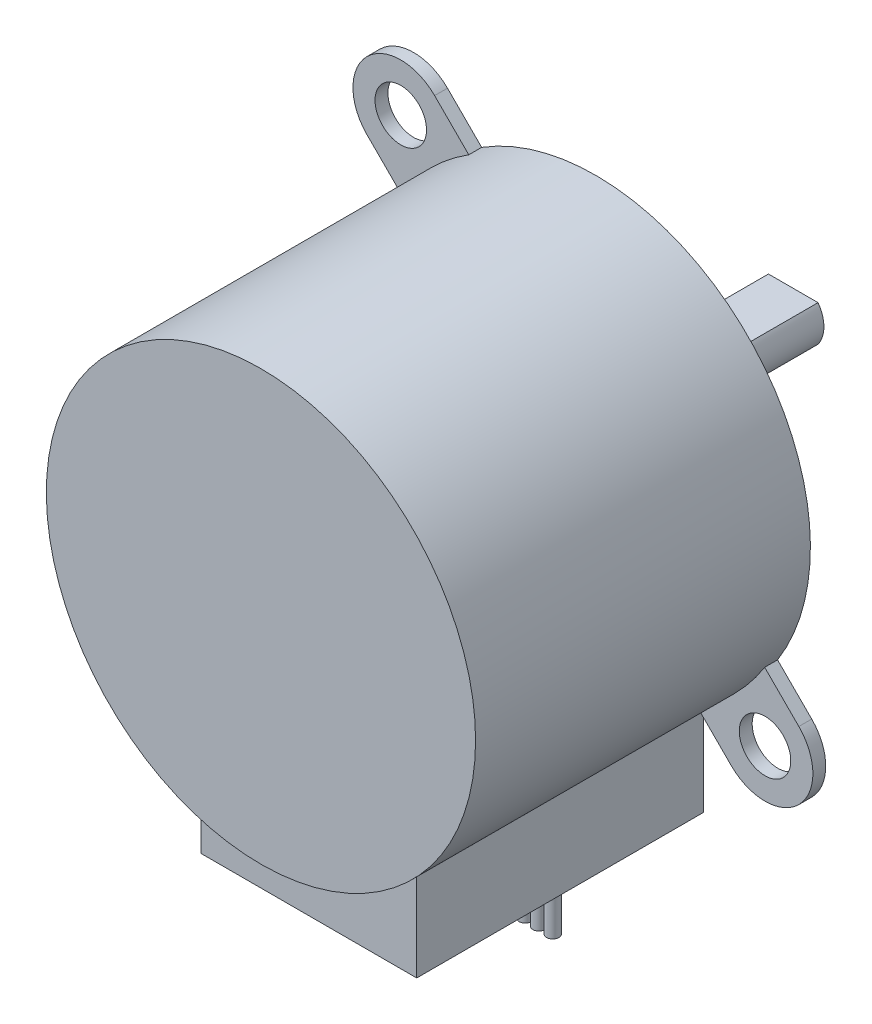
ISO-10303-21;
HEADER;
FILE_DESCRIPTION(('STEP AP214'),'2;1');
FILE_NAME('part.step','',(''),(''),'','','');
FILE_SCHEMA(('AUTOMOTIVE_DESIGN { 1 0 10303 214 1 1 1 1 }'));
ENDSEC;
DATA;
#1=APPLICATION_CONTEXT('core data for automotive mechanical design processes');
#2=APPLICATION_PROTOCOL_DEFINITION('international standard','automotive_design',2000,#1);
#3=PRODUCT_CONTEXT('',#1,'mechanical');
#4=PRODUCT('Part','Part','',(#3));
#5=PRODUCT_RELATED_PRODUCT_CATEGORY('part','',(#4));
#6=PRODUCT_DEFINITION_FORMATION('','',#4);
#7=PRODUCT_DEFINITION_CONTEXT('part definition',#1,'design');
#8=PRODUCT_DEFINITION('design','',#6,#7);
#9=PRODUCT_DEFINITION_SHAPE('','',#8);
#10=(LENGTH_UNIT() NAMED_UNIT(*) SI_UNIT(.MILLI.,.METRE.));
#11=(NAMED_UNIT(*) PLANE_ANGLE_UNIT() SI_UNIT($,.RADIAN.));
#12=(NAMED_UNIT(*) SI_UNIT($,.STERADIAN.) SOLID_ANGLE_UNIT());
#13=UNCERTAINTY_MEASURE_WITH_UNIT(LENGTH_MEASURE(1.E-05),#10,'distance_accuracy_value','');
#14=(GEOMETRIC_REPRESENTATION_CONTEXT(3) GLOBAL_UNCERTAINTY_ASSIGNED_CONTEXT((#13)) GLOBAL_UNIT_ASSIGNED_CONTEXT((#10,
#11,#12)) REPRESENTATION_CONTEXT('',''));
#15=CARTESIAN_POINT('',(0.,0.,0.));
#16=DIRECTION('',(0.,0.,1.));
#17=DIRECTION('',(1.,0.,0.));
#18=AXIS2_PLACEMENT_3D('',#15,#16,#17);
#19=CARTESIAN_POINT('',(0.,0.,27.3));
#20=DIRECTION('',(0.,0.,-1.));
#21=DIRECTION('',(-1.,0.,0.));
#22=AXIS2_PLACEMENT_3D('',#19,#20,#21);
#23=CYLINDRICAL_SURFACE('',#22,17.5);
#24=CARTESIAN_POINT('',(0.,0.,27.3));
#25=DIRECTION('',(0.,0.,1.));
#26=DIRECTION('',(1.,0.,0.));
#27=AXIS2_PLACEMENT_3D('',#24,#25,#26);
#28=CIRCLE('',#27,17.5);
#29=CARTESIAN_POINT('',(17.5,0.,27.3));
#30=VERTEX_POINT('',#29);
#31=EDGE_CURVE('E352',#30,#30,#28,.T.);
#32=ORIENTED_EDGE('',*,*,#31,.F.);
#33=EDGE_LOOP('',(#32));
#34=FACE_BOUND('',#33,.T.);
#35=DIRECTION('',(0.,0.,-1.));
#36=VECTOR('',#35,1.);
#37=CARTESIAN_POINT('',(-14.8208835266277,9.30545063337268,1.05));
#38=LINE('',#37,#36);
#39=CARTESIAN_POINT('',(-14.8208835266277,9.30545063337268,1.05));
#40=VERTEX_POINT('',#39);
#41=CARTESIAN_POINT('',(-14.8208835266277,9.30545063337268,0.));
#42=VERTEX_POINT('',#41);
#43=EDGE_CURVE('E248',#40,#42,#38,.T.);
#44=ORIENTED_EDGE('',*,*,#43,.T.);
#45=CARTESIAN_POINT('',(0.,0.,0.));
#46=DIRECTION('',(0.,0.,1.));
#47=DIRECTION('',(1.,0.,0.));
#48=AXIS2_PLACEMENT_3D('',#45,#46,#47);
#49=CIRCLE('',#48,17.5);
#50=CARTESIAN_POINT('',(-8.8,-15.1264668710178,0.));
#51=VERTEX_POINT('',#50);
#52=EDGE_CURVE('E350',#42,#51,#49,.T.);
#53=ORIENTED_EDGE('',*,*,#52,.T.);
#54=DIRECTION('',(0.,0.,-1.));
#55=VECTOR('',#54,1.);
#56=CARTESIAN_POINT('',(-8.8,-15.1264668710178,23.4));
#57=LINE('',#56,#55);
#58=CARTESIAN_POINT('',(-8.8,-15.1264668710178,23.4));
#59=VERTEX_POINT('',#58);
#60=EDGE_CURVE('E301',#59,#51,#57,.T.);
#61=ORIENTED_EDGE('',*,*,#60,.F.);
#62=CARTESIAN_POINT('',(0.,0.,23.4));
#63=DIRECTION('',(0.,0.,-1.));
#64=DIRECTION('',(-1.,0.,0.));
#65=AXIS2_PLACEMENT_3D('',#62,#63,#64);
#66=CIRCLE('',#65,17.5);
#67=CARTESIAN_POINT('',(8.8,-15.1264668710178,23.4));
#68=VERTEX_POINT('',#67);
#69=EDGE_CURVE('E291',#68,#59,#66,.T.);
#70=ORIENTED_EDGE('',*,*,#69,.F.);
#71=DIRECTION('',(0.,0.,-1.));
#72=VECTOR('',#71,1.);
#73=CARTESIAN_POINT('',(8.8,-15.1264668710178,23.4));
#74=LINE('',#73,#72);
#75=CARTESIAN_POINT('',(8.8,-15.1264668710178,0.));
#76=VERTEX_POINT('',#75);
#77=EDGE_CURVE('E314',#68,#76,#74,.T.);
#78=ORIENTED_EDGE('',*,*,#77,.T.);
#79=CARTESIAN_POINT('',(9.30545063337268,-14.8208835266277,0.));
#80=VERTEX_POINT('',#79);
#81=EDGE_CURVE('E41',#76,#80,#49,.T.);
#82=ORIENTED_EDGE('',*,*,#81,.T.);
#83=DIRECTION('',(0.,0.,-1.));
#84=VECTOR('',#83,1.);
#85=CARTESIAN_POINT('',(9.30545063337268,-14.8208835266277,1.05));
#86=LINE('',#85,#84);
#87=CARTESIAN_POINT('',(9.30545063337268,-14.8208835266277,1.05));
#88=VERTEX_POINT('',#87);
#89=EDGE_CURVE('E285',#88,#80,#86,.T.);
#90=ORIENTED_EDGE('',*,*,#89,.F.);
#91=CARTESIAN_POINT('',(0.,0.,1.05));
#92=DIRECTION('',(0.,0.,-1.));
#93=DIRECTION('',(-1.,0.,0.));
#94=AXIS2_PLACEMENT_3D('',#91,#92,#93);
#95=CIRCLE('',#94,17.5);
#96=CARTESIAN_POINT('',(14.8208835266277,-9.30545063337263,1.05));
#97=VERTEX_POINT('',#96);
#98=EDGE_CURVE('E262',#97,#88,#95,.T.);
#99=ORIENTED_EDGE('',*,*,#98,.F.);
#100=DIRECTION('',(0.,0.,-1.));
#101=VECTOR('',#100,1.);
#102=CARTESIAN_POINT('',(14.8208835266277,-9.30545063337263,1.05));
#103=LINE('',#102,#101);
#104=CARTESIAN_POINT('',(14.8208835266277,-9.30545063337263,0.));
#105=VERTEX_POINT('',#104);
#106=EDGE_CURVE('E282',#97,#105,#103,.T.);
#107=ORIENTED_EDGE('',*,*,#106,.T.);
#108=CARTESIAN_POINT('',(-9.30545063337262,14.8208835266277,0.));
#109=VERTEX_POINT('',#108);
#110=EDGE_CURVE('E356',#105,#109,#49,.T.);
#111=ORIENTED_EDGE('',*,*,#110,.T.);
#112=DIRECTION('',(0.,0.,-1.));
#113=VECTOR('',#112,1.);
#114=CARTESIAN_POINT('',(-9.30545063337263,14.8208835266277,1.05));
#115=LINE('',#114,#113);
#116=CARTESIAN_POINT('',(-9.30545063337263,14.8208835266277,1.05));
#117=VERTEX_POINT('',#116);
#118=EDGE_CURVE('E62',#117,#109,#115,.T.);
#119=ORIENTED_EDGE('',*,*,#118,.F.);
#120=CARTESIAN_POINT('',(0.,0.,1.05));
#121=DIRECTION('',(0.,0.,-1.));
#122=DIRECTION('',(-1.,0.,0.));
#123=AXIS2_PLACEMENT_3D('',#120,#121,#122);
#124=CIRCLE('',#123,17.5);
#125=EDGE_CURVE('E228',#40,#117,#124,.T.);
#126=ORIENTED_EDGE('',*,*,#125,.F.);
#127=EDGE_LOOP('',(#44,#53,#61,#70,#78,#82,#90,#99,#107,#111,#119,#126));
#128=FACE_BOUND('',#127,.T.);
#129=ADVANCED_FACE('F38',(#34,#128),#23,.T.);
#130=CARTESIAN_POINT('',(0.,0.,-7.1));
#131=DIRECTION('',(0.,0.,-1.));
#132=DIRECTION('',(-1.,0.,0.));
#133=AXIS2_PLACEMENT_3D('',#130,#131,#132);
#134=PLANE('',#133);
#135=CARTESIAN_POINT('',(0.,0.,-7.1));
#136=DIRECTION('',(0.,0.,-1.));
#137=DIRECTION('',(-1.,0.,0.));
#138=AXIS2_PLACEMENT_3D('',#135,#136,#137);
#139=CIRCLE('',#138,2.5);
#140=CARTESIAN_POINT('',(-2.02215231869412,1.47,-7.1));
#141=VERTEX_POINT('',#140);
#142=CARTESIAN_POINT('',(2.02215231869412,1.47,-7.1));
#143=VERTEX_POINT('',#142);
#144=EDGE_CURVE('E345',#141,#143,#139,.T.);
#145=ORIENTED_EDGE('',*,*,#144,.T.);
#146=DIRECTION('',(-1.,0.,0.));
#147=VECTOR('',#146,1.);
#148=CARTESIAN_POINT('',(0.,1.47,-7.1));
#149=LINE('',#148,#147);
#150=EDGE_CURVE('E323',#143,#141,#149,.T.);
#151=ORIENTED_EDGE('',*,*,#150,.T.);
#152=EDGE_LOOP('',(#145,#151));
#153=FACE_BOUND('',#152,.T.);
#154=ADVANCED_FACE('F390',(#153),#134,.T.);
#155=CARTESIAN_POINT('',(0.,0.,27.3));
#156=DIRECTION('',(0.,0.,1.));
#157=DIRECTION('',(1.,0.,0.));
#158=AXIS2_PLACEMENT_3D('',#155,#156,#157);
#159=PLANE('',#158);
#160=ORIENTED_EDGE('',*,*,#31,.T.);
#161=EDGE_LOOP('',(#160));
#162=FACE_BOUND('',#161,.T.);
#163=ADVANCED_FACE('F395',(#162),#159,.T.);
#164=CARTESIAN_POINT('',(0.,0.,0.));
#165=DIRECTION('',(0.,0.,1.));
#166=DIRECTION('',(1.,0.,0.));
#167=AXIS2_PLACEMENT_3D('',#164,#165,#166);
#168=PLANE('',#167);
#169=CARTESIAN_POINT('',(0.,0.,0.));
#170=DIRECTION('',(0.,0.,-1.));
#171=DIRECTION('',(-1.,0.,0.));
#172=AXIS2_PLACEMENT_3D('',#169,#170,#171);
#173=CIRCLE('',#172,4.85);
#174=CARTESIAN_POINT('',(-4.85,0.,0.));
#175=VERTEX_POINT('',#174);
#176=EDGE_CURVE('E46',#175,#175,#173,.T.);
#177=ORIENTED_EDGE('',*,*,#176,.F.);
#178=EDGE_LOOP('',(#177));
#179=FACE_BOUND('',#178,.T.);
#180=ORIENTED_EDGE('',*,*,#81,.F.);
#181=DIRECTION('',(0.,-1.,0.));
#182=VECTOR('',#181,1.);
#183=CARTESIAN_POINT('',(8.8,0.,0.));
#184=LINE('',#183,#182);
#185=CARTESIAN_POINT('',(8.8,-23.08,0.));
#186=VERTEX_POINT('',#185);
#187=EDGE_CURVE('E304',#76,#186,#184,.T.);
#188=ORIENTED_EDGE('',*,*,#187,.T.);
#189=DIRECTION('',(-1.,0.,0.));
#190=VECTOR('',#189,1.);
#191=CARTESIAN_POINT('',(0.,-23.08,0.));
#192=LINE('',#191,#190);
#193=CARTESIAN_POINT('',(-8.8,-23.08,0.));
#194=VERTEX_POINT('',#193);
#195=EDGE_CURVE('E292',#186,#194,#192,.T.);
#196=ORIENTED_EDGE('',*,*,#195,.T.);
#197=DIRECTION('',(0.,-1.,0.));
#198=VECTOR('',#197,1.);
#199=CARTESIAN_POINT('',(-8.8,0.,0.));
#200=LINE('',#199,#198);
#201=EDGE_CURVE('E281',#51,#194,#200,.T.);
#202=ORIENTED_EDGE('',*,*,#201,.F.);
#203=ORIENTED_EDGE('',*,*,#52,.F.);
#204=DIRECTION('',(0.707106781186547,-0.707106781186548,0.));
#205=VECTOR('',#204,1.);
#206=CARTESIAN_POINT('',(-2.75771644662752,-2.75771644662751,0.));
#207=LINE('',#206,#205);
#208=CARTESIAN_POINT('',(-17.606958851545,12.09152595829,0.));
#209=VERTEX_POINT('',#208);
#210=EDGE_CURVE('E223',#209,#42,#207,.T.);
#211=ORIENTED_EDGE('',*,*,#210,.F.);
#212=CARTESIAN_POINT('',(-14.8492424049175,14.8492424049175,0.));
#213=DIRECTION('',(0.,0.,-1.));
#214=DIRECTION('',(-1.,0.,0.));
#215=AXIS2_PLACEMENT_3D('',#212,#213,#214);
#216=CIRCLE('',#215,3.9);
#217=CARTESIAN_POINT('',(-12.0915259582899,17.6069588515451,0.));
#218=VERTEX_POINT('',#217);
#219=EDGE_CURVE('E237',#209,#218,#216,.T.);
#220=ORIENTED_EDGE('',*,*,#219,.T.);
#221=DIRECTION('',(-0.707106781186545,0.70710678118655,0.));
#222=VECTOR('',#221,1.);
#223=CARTESIAN_POINT('',(2.75771644662752,2.7577164466275,0.));
#224=LINE('',#223,#222);
#225=EDGE_CURVE('E240',#109,#218,#224,.T.);
#226=ORIENTED_EDGE('',*,*,#225,.F.);
#227=ORIENTED_EDGE('',*,*,#110,.F.);
#228=DIRECTION('',(0.707106781186549,-0.707106781186546,0.));
#229=VECTOR('',#228,1.);
#230=CARTESIAN_POINT('',(2.75771644662751,2.75771644662753,0.));
#231=LINE('',#230,#229);
#232=CARTESIAN_POINT('',(17.606958851545,-12.09152595829,0.));
#233=VERTEX_POINT('',#232);
#234=EDGE_CURVE('E257',#105,#233,#231,.T.);
#235=ORIENTED_EDGE('',*,*,#234,.T.);
#236=CARTESIAN_POINT('',(14.8492424049174,-14.8492424049176,0.));
#237=DIRECTION('',(0.,0.,-1.));
#238=DIRECTION('',(-1.,0.,0.));
#239=AXIS2_PLACEMENT_3D('',#236,#237,#238);
#240=CIRCLE('',#239,3.9);
#241=CARTESIAN_POINT('',(12.0915259582899,-17.6069588515451,0.));
#242=VERTEX_POINT('',#241);
#243=EDGE_CURVE('E271',#242,#233,#240,.F.);
#244=ORIENTED_EDGE('',*,*,#243,.F.);
#245=DIRECTION('',(-0.707106781186548,0.707106781186547,0.));
#246=VECTOR('',#245,1.);
#247=CARTESIAN_POINT('',(-2.75771644662752,-2.75771644662752,0.));
#248=LINE('',#247,#246);
#249=EDGE_CURVE('E274',#242,#80,#248,.T.);
#250=ORIENTED_EDGE('',*,*,#249,.T.);
#251=EDGE_LOOP('',(#180,#188,#196,#202,#203,#211,#220,#226,#227,#235,#244,#250));
#252=FACE_BOUND('',#251,.T.);
#253=CARTESIAN_POINT('',(14.8492424049174,-14.8492424049176,0.));
#254=DIRECTION('',(0.,0.,-1.));
#255=DIRECTION('',(-1.,0.,0.));
#256=AXIS2_PLACEMENT_3D('',#253,#254,#255);
#257=CIRCLE('',#256,2.1);
#258=CARTESIAN_POINT('',(12.7492424049174,-14.8492424049176,0.));
#259=VERTEX_POINT('',#258);
#260=EDGE_CURVE('E247',#259,#259,#257,.T.);
#261=ORIENTED_EDGE('',*,*,#260,.F.);
#262=EDGE_LOOP('',(#261));
#263=FACE_BOUND('',#262,.T.);
#264=CARTESIAN_POINT('',(-14.8492424049175,14.8492424049175,0.));
#265=DIRECTION('',(0.,0.,-1.));
#266=DIRECTION('',(-1.,0.,0.));
#267=AXIS2_PLACEMENT_3D('',#264,#265,#266);
#268=CIRCLE('',#267,2.1);
#269=CARTESIAN_POINT('',(-16.9492424049175,14.8492424049175,0.));
#270=VERTEX_POINT('',#269);
#271=EDGE_CURVE('E215',#270,#270,#268,.T.);
#272=ORIENTED_EDGE('',*,*,#271,.F.);
#273=EDGE_LOOP('',(#272));
#274=FACE_BOUND('',#273,.T.);
#275=ADVANCED_FACE('F365',(#179,#252,#263,#274),#168,.F.);
#276=CARTESIAN_POINT('',(0.,0.,-2.5));
#277=DIRECTION('',(0.,0.,1.));
#278=DIRECTION('',(1.,0.,0.));
#279=AXIS2_PLACEMENT_3D('',#276,#277,#278);
#280=CYLINDRICAL_SURFACE('',#279,4.85);
#281=CARTESIAN_POINT('',(0.,0.,-2.5));
#282=DIRECTION('',(0.,0.,-1.));
#283=DIRECTION('',(-1.,0.,0.));
#284=AXIS2_PLACEMENT_3D('',#281,#282,#283);
#285=CIRCLE('',#284,4.85);
#286=CARTESIAN_POINT('',(-4.85,0.,-2.5));
#287=VERTEX_POINT('',#286);
#288=EDGE_CURVE('E346',#287,#287,#285,.T.);
#289=ORIENTED_EDGE('',*,*,#288,.F.);
#290=EDGE_LOOP('',(#289));
#291=FACE_BOUND('',#290,.T.);
#292=ORIENTED_EDGE('',*,*,#176,.T.);
#293=EDGE_LOOP('',(#292));
#294=FACE_BOUND('',#293,.T.);
#295=ADVANCED_FACE('F666',(#291,#294),#280,.T.);
#296=CARTESIAN_POINT('',(0.,0.,-2.5));
#297=DIRECTION('',(0.,0.,-1.));
#298=DIRECTION('',(-1.,0.,0.));
#299=AXIS2_PLACEMENT_3D('',#296,#297,#298);
#300=PLANE('',#299);
#301=CARTESIAN_POINT('',(0.,0.,-2.5));
#302=DIRECTION('',(0.,0.,-1.));
#303=DIRECTION('',(-1.,0.,0.));
#304=AXIS2_PLACEMENT_3D('',#301,#302,#303);
#305=CIRCLE('',#304,2.5);
#306=CARTESIAN_POINT('',(-2.5,0.,-2.5));
#307=VERTEX_POINT('',#306);
#308=EDGE_CURVE('E11',#307,#307,#305,.T.);
#309=ORIENTED_EDGE('',*,*,#308,.F.);
#310=EDGE_LOOP('',(#309));
#311=FACE_BOUND('',#310,.T.);
#312=ORIENTED_EDGE('',*,*,#288,.T.);
#313=EDGE_LOOP('',(#312));
#314=FACE_BOUND('',#313,.T.);
#315=ADVANCED_FACE('F415',(#311,#314),#300,.T.);
#316=CARTESIAN_POINT('',(0.,0.,-7.1));
#317=DIRECTION('',(0.,0.,1.));
#318=DIRECTION('',(1.,0.,0.));
#319=AXIS2_PLACEMENT_3D('',#316,#317,#318);
#320=CYLINDRICAL_SURFACE('',#319,2.5);
#321=ORIENTED_EDGE('',*,*,#144,.F.);
#322=DIRECTION('',(0.,0.,1.));
#323=VECTOR('',#322,1.);
#324=CARTESIAN_POINT('',(-2.02215231869412,1.47,-16.1));
#325=LINE('',#324,#323);
#326=CARTESIAN_POINT('',(-2.02215231869412,1.47,-16.1));
#327=VERTEX_POINT('',#326);
#328=EDGE_CURVE('E335',#327,#141,#325,.T.);
#329=ORIENTED_EDGE('',*,*,#328,.F.);
#330=CARTESIAN_POINT('',(0.,0.,-16.1));
#331=DIRECTION('',(0.,0.,-1.));
#332=DIRECTION('',(-1.,0.,0.));
#333=AXIS2_PLACEMENT_3D('',#330,#331,#332);
#334=CIRCLE('',#333,2.5);
#335=CARTESIAN_POINT('',(-2.02215231869412,-1.47,-16.1));
#336=VERTEX_POINT('',#335);
#337=EDGE_CURVE('E324',#336,#327,#334,.T.);
#338=ORIENTED_EDGE('',*,*,#337,.F.);
#339=DIRECTION('',(0.,0.,1.));
#340=VECTOR('',#339,1.);
#341=CARTESIAN_POINT('',(-2.02215231869412,-1.47,-16.1));
#342=LINE('',#341,#340);
#343=CARTESIAN_POINT('',(-2.02215231869412,-1.47,-7.1));
#344=VERTEX_POINT('',#343);
#345=EDGE_CURVE('E338',#336,#344,#342,.T.);
#346=ORIENTED_EDGE('',*,*,#345,.T.);
#347=CARTESIAN_POINT('',(2.02215231869412,-1.47,-7.1));
#348=VERTEX_POINT('',#347);
#349=EDGE_CURVE('E344',#348,#344,#139,.T.);
#350=ORIENTED_EDGE('',*,*,#349,.F.);
#351=DIRECTION('',(0.,0.,1.));
#352=VECTOR('',#351,1.);
#353=CARTESIAN_POINT('',(2.02215231869412,-1.47,-16.1));
#354=LINE('',#353,#352);
#355=CARTESIAN_POINT('',(2.02215231869412,-1.47,-16.1));
#356=VERTEX_POINT('',#355);
#357=EDGE_CURVE('E341',#356,#348,#354,.T.);
#358=ORIENTED_EDGE('',*,*,#357,.F.);
#359=CARTESIAN_POINT('',(2.02215231869412,1.47,-16.1));
#360=VERTEX_POINT('',#359);
#361=EDGE_CURVE('E319',#360,#356,#334,.T.);
#362=ORIENTED_EDGE('',*,*,#361,.F.);
#363=DIRECTION('',(0.,0.,1.));
#364=VECTOR('',#363,1.);
#365=CARTESIAN_POINT('',(2.02215231869412,1.47,-16.1));
#366=LINE('',#365,#364);
#367=EDGE_CURVE('E329',#360,#143,#366,.T.);
#368=ORIENTED_EDGE('',*,*,#367,.T.);
#369=EDGE_LOOP('',(#321,#329,#338,#346,#350,#358,#362,#368));
#370=FACE_BOUND('',#369,.T.);
#371=ORIENTED_EDGE('',*,*,#308,.T.);
#372=EDGE_LOOP('',(#371));
#373=FACE_BOUND('',#372,.T.);
#374=ADVANCED_FACE('F407',(#370,#373),#320,.T.);
#375=DIRECTION('',(-1.,0.,0.));
#376=VECTOR('',#375,1.);
#377=CARTESIAN_POINT('',(0.,-1.47,-7.1));
#378=LINE('',#377,#376);
#379=EDGE_CURVE('E311',#348,#344,#378,.T.);
#380=ORIENTED_EDGE('',*,*,#379,.F.);
#381=ORIENTED_EDGE('',*,*,#349,.T.);
#382=EDGE_LOOP('',(#380,#381));
#383=FACE_BOUND('',#382,.T.);
#384=ADVANCED_FACE('F398',(#383),#134,.T.);
#385=CARTESIAN_POINT('',(0.,-1.47,-16.1));
#386=DIRECTION('',(0.,1.,0.));
#387=DIRECTION('',(0.,0.,1.));
#388=AXIS2_PLACEMENT_3D('',#385,#386,#387);
#389=PLANE('',#388);
#390=ORIENTED_EDGE('',*,*,#379,.T.);
#391=ORIENTED_EDGE('',*,*,#345,.F.);
#392=DIRECTION('',(-1.,0.,0.));
#393=VECTOR('',#392,1.);
#394=CARTESIAN_POINT('',(0.,-1.47,-16.1));
#395=LINE('',#394,#393);
#396=EDGE_CURVE('E322',#356,#336,#395,.T.);
#397=ORIENTED_EDGE('',*,*,#396,.F.);
#398=ORIENTED_EDGE('',*,*,#357,.T.);
#399=EDGE_LOOP('',(#390,#391,#397,#398));
#400=FACE_BOUND('',#399,.T.);
#401=ADVANCED_FACE('F406',(#400),#389,.F.);
#402=CARTESIAN_POINT('',(0.,1.47,-16.1));
#403=DIRECTION('',(0.,1.,0.));
#404=DIRECTION('',(0.,0.,1.));
#405=AXIS2_PLACEMENT_3D('',#402,#403,#404);
#406=PLANE('',#405);
#407=ORIENTED_EDGE('',*,*,#150,.F.);
#408=ORIENTED_EDGE('',*,*,#367,.F.);
#409=DIRECTION('',(-1.,0.,0.));
#410=VECTOR('',#409,1.);
#411=CARTESIAN_POINT('',(0.,1.47,-16.1));
#412=LINE('',#411,#410);
#413=EDGE_CURVE('E326',#360,#327,#412,.T.);
#414=ORIENTED_EDGE('',*,*,#413,.T.);
#415=ORIENTED_EDGE('',*,*,#328,.T.);
#416=EDGE_LOOP('',(#407,#408,#414,#415));
#417=FACE_BOUND('',#416,.T.);
#418=ADVANCED_FACE('F413',(#417),#406,.T.);
#419=CARTESIAN_POINT('',(0.,0.,-16.1));
#420=DIRECTION('',(0.,0.,-1.));
#421=DIRECTION('',(-1.,0.,0.));
#422=AXIS2_PLACEMENT_3D('',#419,#420,#421);
#423=PLANE('',#422);
#424=ORIENTED_EDGE('',*,*,#361,.T.);
#425=ORIENTED_EDGE('',*,*,#396,.T.);
#426=ORIENTED_EDGE('',*,*,#337,.T.);
#427=ORIENTED_EDGE('',*,*,#413,.F.);
#428=EDGE_LOOP('',(#424,#425,#426,#427));
#429=FACE_BOUND('',#428,.T.);
#430=ADVANCED_FACE('F426',(#429),#423,.T.);
#431=CARTESIAN_POINT('',(-8.8,0.,23.4));
#432=DIRECTION('',(1.,0.,0.));
#433=DIRECTION('',(0.,1.,0.));
#434=AXIS2_PLACEMENT_3D('',#431,#432,#433);
#435=PLANE('',#434);
#436=ORIENTED_EDGE('',*,*,#201,.T.);
#437=DIRECTION('',(0.,0.,-1.));
#438=VECTOR('',#437,1.);
#439=CARTESIAN_POINT('',(-8.8,-23.08,23.4));
#440=LINE('',#439,#438);
#441=CARTESIAN_POINT('',(-8.8,-23.08,23.4));
#442=VERTEX_POINT('',#441);
#443=EDGE_CURVE('E309',#442,#194,#440,.T.);
#444=ORIENTED_EDGE('',*,*,#443,.F.);
#445=DIRECTION('',(0.,-1.,0.));
#446=VECTOR('',#445,1.);
#447=CARTESIAN_POINT('',(-8.8,0.,23.4));
#448=LINE('',#447,#446);
#449=EDGE_CURVE('E289',#59,#442,#448,.T.);
#450=ORIENTED_EDGE('',*,*,#449,.F.);
#451=ORIENTED_EDGE('',*,*,#60,.T.);
#452=EDGE_LOOP('',(#436,#444,#450,#451));
#453=FACE_BOUND('',#452,.T.);
#454=ADVANCED_FACE('F363',(#453),#435,.F.);
#455=CARTESIAN_POINT('',(0.,-23.08,23.4));
#456=DIRECTION('',(0.,-1.,0.));
#457=DIRECTION('',(0.,0.,-1.));
#458=AXIS2_PLACEMENT_3D('',#455,#456,#457);
#459=PLANE('',#458);
#460=CARTESIAN_POINT('',(-2.,-23.08,5.8));
#461=DIRECTION('',(0.,-1.,0.));
#462=DIRECTION('',(0.,0.,-1.));
#463=AXIS2_PLACEMENT_3D('',#460,#461,#462);
#464=CIRCLE('',#463,0.800000000000001);
#465=CARTESIAN_POINT('',(-2.,-23.08,6.6));
#466=VERTEX_POINT('',#465);
#467=CARTESIAN_POINT('',(-2.,-23.08,5.));
#468=VERTEX_POINT('',#467);
#469=EDGE_CURVE('E54',#466,#468,#464,.T.);
#470=ORIENTED_EDGE('',*,*,#469,.F.);
#471=DIRECTION('',(-1.,0.,0.));
#472=VECTOR('',#471,1.);
#473=CARTESIAN_POINT('',(-2.,-23.08,6.6));
#474=LINE('',#473,#472);
#475=CARTESIAN_POINT('',(2.,-23.08,6.6));
#476=VERTEX_POINT('',#475);
#477=EDGE_CURVE('E196',#476,#466,#474,.T.);
#478=ORIENTED_EDGE('',*,*,#477,.F.);
#479=CARTESIAN_POINT('',(2.,-23.08,5.8));
#480=DIRECTION('',(0.,-1.,0.));
#481=DIRECTION('',(0.,0.,-1.));
#482=AXIS2_PLACEMENT_3D('',#479,#480,#481);
#483=CIRCLE('',#482,0.800000000000001);
#484=CARTESIAN_POINT('',(2.,-23.08,5.));
#485=VERTEX_POINT('',#484);
#486=EDGE_CURVE('E199',#485,#476,#483,.T.);
#487=ORIENTED_EDGE('',*,*,#486,.F.);
#488=DIRECTION('',(1.,0.,0.));
#489=VECTOR('',#488,1.);
#490=CARTESIAN_POINT('',(-2.,-23.08,5.));
#491=LINE('',#490,#489);
#492=EDGE_CURVE('E208',#468,#485,#491,.T.);
#493=ORIENTED_EDGE('',*,*,#492,.F.);
#494=EDGE_LOOP('',(#470,#478,#487,#493));
#495=FACE_BOUND('',#494,.T.);
#496=ORIENTED_EDGE('',*,*,#195,.F.);
#497=DIRECTION('',(0.,0.,-1.));
#498=VECTOR('',#497,1.);
#499=CARTESIAN_POINT('',(8.8,-23.08,23.4));
#500=LINE('',#499,#498);
#501=CARTESIAN_POINT('',(8.8,-23.08,23.4));
#502=VERTEX_POINT('',#501);
#503=EDGE_CURVE('E312',#502,#186,#500,.T.);
#504=ORIENTED_EDGE('',*,*,#503,.F.);
#505=DIRECTION('',(-1.,0.,0.));
#506=VECTOR('',#505,1.);
#507=CARTESIAN_POINT('',(0.,-23.08,23.4));
#508=LINE('',#507,#506);
#509=EDGE_CURVE('E298',#502,#442,#508,.T.);
#510=ORIENTED_EDGE('',*,*,#509,.T.);
#511=ORIENTED_EDGE('',*,*,#443,.T.);
#512=EDGE_LOOP('',(#496,#504,#510,#511));
#513=FACE_BOUND('',#512,.T.);
#514=ADVANCED_FACE('F370',(#495,#513),#459,.T.);
#515=CARTESIAN_POINT('',(8.8,0.,23.4));
#516=DIRECTION('',(1.,0.,0.));
#517=DIRECTION('',(0.,1.,0.));
#518=AXIS2_PLACEMENT_3D('',#515,#516,#517);
#519=PLANE('',#518);
#520=ORIENTED_EDGE('',*,*,#187,.F.);
#521=ORIENTED_EDGE('',*,*,#77,.F.);
#522=DIRECTION('',(0.,-1.,0.));
#523=VECTOR('',#522,1.);
#524=CARTESIAN_POINT('',(8.8,0.,23.4));
#525=LINE('',#524,#523);
#526=EDGE_CURVE('E295',#68,#502,#525,.T.);
#527=ORIENTED_EDGE('',*,*,#526,.T.);
#528=ORIENTED_EDGE('',*,*,#503,.T.);
#529=EDGE_LOOP('',(#520,#521,#527,#528));
#530=FACE_BOUND('',#529,.T.);
#531=ADVANCED_FACE('F377',(#530),#519,.T.);
#532=CARTESIAN_POINT('',(0.,0.,23.4));
#533=DIRECTION('',(0.,0.,-1.));
#534=DIRECTION('',(-1.,0.,0.));
#535=AXIS2_PLACEMENT_3D('',#532,#533,#534);
#536=PLANE('',#535);
#537=ORIENTED_EDGE('',*,*,#449,.T.);
#538=ORIENTED_EDGE('',*,*,#509,.F.);
#539=ORIENTED_EDGE('',*,*,#526,.F.);
#540=ORIENTED_EDGE('',*,*,#69,.T.);
#541=EDGE_LOOP('',(#537,#538,#539,#540));
#542=FACE_BOUND('',#541,.T.);
#543=ADVANCED_FACE('F374',(#542),#536,.F.);
#544=CARTESIAN_POINT('',(14.8492424049174,-14.8492424049176,1.05));
#545=DIRECTION('',(0.,0.,-1.));
#546=DIRECTION('',(-1.,0.,0.));
#547=AXIS2_PLACEMENT_3D('',#544,#545,#546);
#548=CYLINDRICAL_SURFACE('',#547,3.9);
#549=ORIENTED_EDGE('',*,*,#243,.T.);
#550=DIRECTION('',(0.,0.,-1.));
#551=VECTOR('',#550,1.);
#552=CARTESIAN_POINT('',(17.606958851545,-12.09152595829,1.05));
#553=LINE('',#552,#551);
#554=CARTESIAN_POINT('',(17.606958851545,-12.09152595829,1.05));
#555=VERTEX_POINT('',#554);
#556=EDGE_CURVE('E279',#555,#233,#553,.T.);
#557=ORIENTED_EDGE('',*,*,#556,.F.);
#558=CARTESIAN_POINT('',(14.8492424049174,-14.8492424049176,1.05));
#559=DIRECTION('',(0.,0.,-1.));
#560=DIRECTION('',(-1.,0.,0.));
#561=AXIS2_PLACEMENT_3D('',#558,#559,#560);
#562=CIRCLE('',#561,3.9);
#563=CARTESIAN_POINT('',(12.0915259582899,-17.6069588515451,1.05));
#564=VERTEX_POINT('',#563);
#565=EDGE_CURVE('E256',#564,#555,#562,.F.);
#566=ORIENTED_EDGE('',*,*,#565,.F.);
#567=DIRECTION('',(0.,0.,-1.));
#568=VECTOR('',#567,1.);
#569=CARTESIAN_POINT('',(12.0915259582899,-17.6069588515451,1.05));
#570=LINE('',#569,#568);
#571=EDGE_CURVE('E268',#564,#242,#570,.T.);
#572=ORIENTED_EDGE('',*,*,#571,.T.);
#573=EDGE_LOOP('',(#549,#557,#566,#572));
#574=FACE_BOUND('',#573,.T.);
#575=ADVANCED_FACE('F384',(#574),#548,.T.);
#576=CARTESIAN_POINT('',(2.75771644662751,2.75771644662753,1.05));
#577=DIRECTION('',(0.707106781186546,0.707106781186549,0.));
#578=DIRECTION('',(-0.707106781186549,0.707106781186546,0.));
#579=AXIS2_PLACEMENT_3D('',#576,#577,#578);
#580=PLANE('',#579);
#581=ORIENTED_EDGE('',*,*,#234,.F.);
#582=ORIENTED_EDGE('',*,*,#106,.F.);
#583=DIRECTION('',(0.707106781186549,-0.707106781186546,0.));
#584=VECTOR('',#583,1.);
#585=CARTESIAN_POINT('',(2.75771644662751,2.75771644662753,1.05));
#586=LINE('',#585,#584);
#587=EDGE_CURVE('E265',#97,#555,#586,.T.);
#588=ORIENTED_EDGE('',*,*,#587,.T.);
#589=ORIENTED_EDGE('',*,*,#556,.T.);
#590=EDGE_LOOP('',(#581,#582,#588,#589));
#591=FACE_BOUND('',#590,.T.);
#592=ADVANCED_FACE('F646',(#591),#580,.T.);
#593=CARTESIAN_POINT('',(14.8492424049174,-14.8492424049176,1.05));
#594=DIRECTION('',(0.,0.,-1.));
#595=DIRECTION('',(-1.,0.,0.));
#596=AXIS2_PLACEMENT_3D('',#593,#594,#595);
#597=CYLINDRICAL_SURFACE('',#596,2.1);
#598=CARTESIAN_POINT('',(14.8492424049174,-14.8492424049176,1.05));
#599=DIRECTION('',(0.,0.,-1.));
#600=DIRECTION('',(-1.,0.,0.));
#601=AXIS2_PLACEMENT_3D('',#598,#599,#600);
#602=CIRCLE('',#601,2.1);
#603=CARTESIAN_POINT('',(12.7492424049174,-14.8492424049176,1.05));
#604=VERTEX_POINT('',#603);
#605=EDGE_CURVE('E253',#604,#604,#602,.T.);
#606=ORIENTED_EDGE('',*,*,#605,.F.);
#607=EDGE_LOOP('',(#606));
#608=FACE_BOUND('',#607,.T.);
#609=ORIENTED_EDGE('',*,*,#260,.T.);
#610=EDGE_LOOP('',(#609));
#611=FACE_BOUND('',#610,.T.);
#612=ADVANCED_FACE('F649',(#608,#611),#597,.F.);
#613=CARTESIAN_POINT('',(-2.75771644662752,-2.75771644662752,1.05));
#614=DIRECTION('',(-0.707106781186547,-0.707106781186548,0.));
#615=DIRECTION('',(0.707106781186548,-0.707106781186547,0.));
#616=AXIS2_PLACEMENT_3D('',#613,#614,#615);
#617=PLANE('',#616);
#618=ORIENTED_EDGE('',*,*,#249,.F.);
#619=ORIENTED_EDGE('',*,*,#571,.F.);
#620=DIRECTION('',(-0.707106781186548,0.707106781186547,0.));
#621=VECTOR('',#620,1.);
#622=CARTESIAN_POINT('',(-2.75771644662752,-2.75771644662752,1.05));
#623=LINE('',#622,#621);
#624=EDGE_CURVE('E259',#564,#88,#623,.T.);
#625=ORIENTED_EDGE('',*,*,#624,.T.);
#626=ORIENTED_EDGE('',*,*,#89,.T.);
#627=EDGE_LOOP('',(#618,#619,#625,#626));
#628=FACE_BOUND('',#627,.T.);
#629=ADVANCED_FACE('F644',(#628),#617,.T.);
#630=CARTESIAN_POINT('',(0.,0.,1.05));
#631=DIRECTION('',(0.,0.,-1.));
#632=DIRECTION('',(-1.,0.,0.));
#633=AXIS2_PLACEMENT_3D('',#630,#631,#632);
#634=PLANE('',#633);
#635=ORIENTED_EDGE('',*,*,#605,.T.);
#636=EDGE_LOOP('',(#635));
#637=FACE_BOUND('',#636,.T.);
#638=ORIENTED_EDGE('',*,*,#565,.T.);
#639=ORIENTED_EDGE('',*,*,#587,.F.);
#640=ORIENTED_EDGE('',*,*,#98,.T.);
#641=ORIENTED_EDGE('',*,*,#624,.F.);
#642=EDGE_LOOP('',(#638,#639,#640,#641));
#643=FACE_BOUND('',#642,.T.);
#644=ADVANCED_FACE('F637',(#637,#643),#634,.F.);
#645=CARTESIAN_POINT('',(-14.8492424049175,14.8492424049175,1.05));
#646=DIRECTION('',(0.,0.,-1.));
#647=DIRECTION('',(-1.,0.,0.));
#648=AXIS2_PLACEMENT_3D('',#645,#646,#647);
#649=CYLINDRICAL_SURFACE('',#648,3.9);
#650=ORIENTED_EDGE('',*,*,#219,.F.);
#651=DIRECTION('',(0.,0.,-1.));
#652=VECTOR('',#651,1.);
#653=CARTESIAN_POINT('',(-17.606958851545,12.09152595829,1.05));
#654=LINE('',#653,#652);
#655=CARTESIAN_POINT('',(-17.606958851545,12.09152595829,1.05));
#656=VERTEX_POINT('',#655);
#657=EDGE_CURVE('E245',#656,#209,#654,.T.);
#658=ORIENTED_EDGE('',*,*,#657,.F.);
#659=CARTESIAN_POINT('',(-14.8492424049175,14.8492424049175,1.05));
#660=DIRECTION('',(0.,0.,-1.));
#661=DIRECTION('',(-1.,0.,0.));
#662=AXIS2_PLACEMENT_3D('',#659,#660,#661);
#663=CIRCLE('',#662,3.9);
#664=CARTESIAN_POINT('',(-12.0915259582899,17.6069588515451,1.05));
#665=VERTEX_POINT('',#664);
#666=EDGE_CURVE('E222',#656,#665,#663,.T.);
#667=ORIENTED_EDGE('',*,*,#666,.T.);
#668=DIRECTION('',(0.,0.,-1.));
#669=VECTOR('',#668,1.);
#670=CARTESIAN_POINT('',(-12.0915259582899,17.6069588515451,1.05));
#671=LINE('',#670,#669);
#672=EDGE_CURVE('E234',#665,#218,#671,.T.);
#673=ORIENTED_EDGE('',*,*,#672,.T.);
#674=EDGE_LOOP('',(#650,#658,#667,#673));
#675=FACE_BOUND('',#674,.T.);
#676=ADVANCED_FACE('F630',(#675),#649,.T.);
#677=CARTESIAN_POINT('',(-2.75771644662752,-2.75771644662751,1.05));
#678=DIRECTION('',(0.707106781186548,0.707106781186547,0.));
#679=DIRECTION('',(-0.707106781186547,0.707106781186548,0.));
#680=AXIS2_PLACEMENT_3D('',#677,#678,#679);
#681=PLANE('',#680);
#682=ORIENTED_EDGE('',*,*,#210,.T.);
#683=ORIENTED_EDGE('',*,*,#43,.F.);
#684=DIRECTION('',(0.707106781186547,-0.707106781186548,0.));
#685=VECTOR('',#684,1.);
#686=CARTESIAN_POINT('',(-2.75771644662752,-2.75771644662751,1.05));
#687=LINE('',#686,#685);
#688=EDGE_CURVE('E231',#656,#40,#687,.T.);
#689=ORIENTED_EDGE('',*,*,#688,.F.);
#690=ORIENTED_EDGE('',*,*,#657,.T.);
#691=EDGE_LOOP('',(#682,#683,#689,#690));
#692=FACE_BOUND('',#691,.T.);
#693=ADVANCED_FACE('F626',(#692),#681,.F.);
#694=CARTESIAN_POINT('',(-14.8492424049175,14.8492424049175,1.05));
#695=DIRECTION('',(0.,0.,-1.));
#696=DIRECTION('',(-1.,0.,0.));
#697=AXIS2_PLACEMENT_3D('',#694,#695,#696);
#698=CYLINDRICAL_SURFACE('',#697,2.1);
#699=CARTESIAN_POINT('',(-14.8492424049175,14.8492424049175,1.05));
#700=DIRECTION('',(0.,0.,-1.));
#701=DIRECTION('',(-1.,0.,0.));
#702=AXIS2_PLACEMENT_3D('',#699,#700,#701);
#703=CIRCLE('',#702,2.1);
#704=CARTESIAN_POINT('',(-16.9492424049175,14.8492424049175,1.05));
#705=VERTEX_POINT('',#704);
#706=EDGE_CURVE('E219',#705,#705,#703,.T.);
#707=ORIENTED_EDGE('',*,*,#706,.F.);
#708=EDGE_LOOP('',(#707));
#709=FACE_BOUND('',#708,.T.);
#710=ORIENTED_EDGE('',*,*,#271,.T.);
#711=EDGE_LOOP('',(#710));
#712=FACE_BOUND('',#711,.T.);
#713=ADVANCED_FACE('F629',(#709,#712),#698,.F.);
#714=CARTESIAN_POINT('',(2.75771644662752,2.7577164466275,1.05));
#715=DIRECTION('',(-0.70710678118655,-0.707106781186545,0.));
#716=DIRECTION('',(0.707106781186545,-0.70710678118655,0.));
#717=AXIS2_PLACEMENT_3D('',#714,#715,#716);
#718=PLANE('',#717);
#719=ORIENTED_EDGE('',*,*,#225,.T.);
#720=ORIENTED_EDGE('',*,*,#672,.F.);
#721=DIRECTION('',(-0.707106781186545,0.70710678118655,0.));
#722=VECTOR('',#721,1.);
#723=CARTESIAN_POINT('',(2.75771644662752,2.7577164466275,1.05));
#724=LINE('',#723,#722);
#725=EDGE_CURVE('E226',#117,#665,#724,.T.);
#726=ORIENTED_EDGE('',*,*,#725,.F.);
#727=ORIENTED_EDGE('',*,*,#118,.T.);
#728=EDGE_LOOP('',(#719,#720,#726,#727));
#729=FACE_BOUND('',#728,.T.);
#730=ADVANCED_FACE('F624',(#729),#718,.F.);
#731=CARTESIAN_POINT('',(0.,0.,1.05));
#732=DIRECTION('',(0.,0.,-1.));
#733=DIRECTION('',(-1.,0.,0.));
#734=AXIS2_PLACEMENT_3D('',#731,#732,#733);
#735=PLANE('',#734);
#736=ORIENTED_EDGE('',*,*,#706,.T.);
#737=EDGE_LOOP('',(#736));
#738=FACE_BOUND('',#737,.T.);
#739=ORIENTED_EDGE('',*,*,#666,.F.);
#740=ORIENTED_EDGE('',*,*,#688,.T.);
#741=ORIENTED_EDGE('',*,*,#125,.T.);
#742=ORIENTED_EDGE('',*,*,#725,.T.);
#743=EDGE_LOOP('',(#739,#740,#741,#742));
#744=FACE_BOUND('',#743,.T.);
#745=ADVANCED_FACE('F452',(#738,#744),#735,.F.);
#746=CARTESIAN_POINT('',(-2.,-22.03,5.8));
#747=DIRECTION('',(0.,-1.,0.));
#748=DIRECTION('',(0.,0.,-1.));
#749=AXIS2_PLACEMENT_3D('',#746,#747,#748);
#750=CYLINDRICAL_SURFACE('',#749,0.800000000000001);
#751=ORIENTED_EDGE('',*,*,#469,.T.);
#752=DIRECTION('',(0.,-1.,0.));
#753=VECTOR('',#752,1.);
#754=CARTESIAN_POINT('',(-2.,-22.03,5.));
#755=LINE('',#754,#753);
#756=CARTESIAN_POINT('',(-2.,-22.03,5.));
#757=VERTEX_POINT('',#756);
#758=EDGE_CURVE('E174',#757,#468,#755,.T.);
#759=ORIENTED_EDGE('',*,*,#758,.F.);
#760=CARTESIAN_POINT('',(-2.,-22.03,5.8));
#761=DIRECTION('',(0.,-1.,0.));
#762=DIRECTION('',(0.,0.,-1.));
#763=AXIS2_PLACEMENT_3D('',#760,#761,#762);
#764=CIRCLE('',#763,0.800000000000001);
#765=CARTESIAN_POINT('',(-2.,-22.03,6.6));
#766=VERTEX_POINT('',#765);
#767=EDGE_CURVE('E178',#766,#757,#764,.T.);
#768=ORIENTED_EDGE('',*,*,#767,.F.);
#769=DIRECTION('',(0.,-1.,0.));
#770=VECTOR('',#769,1.);
#771=CARTESIAN_POINT('',(-2.,-22.03,6.6));
#772=LINE('',#771,#770);
#773=EDGE_CURVE('E213',#766,#466,#772,.T.);
#774=ORIENTED_EDGE('',*,*,#773,.T.);
#775=EDGE_LOOP('',(#751,#759,#768,#774));
#776=FACE_BOUND('',#775,.T.);
#777=ADVANCED_FACE('F176',(#776),#750,.F.);
#778=CARTESIAN_POINT('',(-2.,-22.03,6.6));
#779=DIRECTION('',(0.,0.,1.));
#780=DIRECTION('',(1.,0.,0.));
#781=AXIS2_PLACEMENT_3D('',#778,#779,#780);
#782=PLANE('',#781);
#783=ORIENTED_EDGE('',*,*,#477,.T.);
#784=ORIENTED_EDGE('',*,*,#773,.F.);
#785=DIRECTION('',(-1.,0.,0.));
#786=VECTOR('',#785,1.);
#787=CARTESIAN_POINT('',(-2.,-22.03,6.6));
#788=LINE('',#787,#786);
#789=CARTESIAN_POINT('',(2.,-22.03,6.6));
#790=VERTEX_POINT('',#789);
#791=EDGE_CURVE('E184',#790,#766,#788,.T.);
#792=ORIENTED_EDGE('',*,*,#791,.F.);
#793=DIRECTION('',(0.,-1.,0.));
#794=VECTOR('',#793,1.);
#795=CARTESIAN_POINT('',(2.,-22.03,6.6));
#796=LINE('',#795,#794);
#797=EDGE_CURVE('E216',#790,#476,#796,.T.);
#798=ORIENTED_EDGE('',*,*,#797,.T.);
#799=EDGE_LOOP('',(#783,#784,#792,#798));
#800=FACE_BOUND('',#799,.T.);
#801=ADVANCED_FACE('F461',(#800),#782,.F.);
#802=CARTESIAN_POINT('',(2.,-22.03,5.8));
#803=DIRECTION('',(0.,-1.,0.));
#804=DIRECTION('',(0.,0.,-1.));
#805=AXIS2_PLACEMENT_3D('',#802,#803,#804);
#806=CYLINDRICAL_SURFACE('',#805,0.800000000000001);
#807=ORIENTED_EDGE('',*,*,#486,.T.);
#808=ORIENTED_EDGE('',*,*,#797,.F.);
#809=CARTESIAN_POINT('',(2.,-22.03,5.8));
#810=DIRECTION('',(0.,-1.,0.));
#811=DIRECTION('',(0.,0.,-1.));
#812=AXIS2_PLACEMENT_3D('',#809,#810,#811);
#813=CIRCLE('',#812,0.800000000000001);
#814=CARTESIAN_POINT('',(2.,-22.03,5.));
#815=VERTEX_POINT('',#814);
#816=EDGE_CURVE('E192',#815,#790,#813,.T.);
#817=ORIENTED_EDGE('',*,*,#816,.F.);
#818=DIRECTION('',(0.,-1.,0.));
#819=VECTOR('',#818,1.);
#820=CARTESIAN_POINT('',(2.,-22.03,5.));
#821=LINE('',#820,#819);
#822=EDGE_CURVE('E183',#815,#485,#821,.T.);
#823=ORIENTED_EDGE('',*,*,#822,.T.);
#824=EDGE_LOOP('',(#807,#808,#817,#823));
#825=FACE_BOUND('',#824,.T.);
#826=ADVANCED_FACE('F470',(#825),#806,.F.);
#827=CARTESIAN_POINT('',(-2.,-22.03,5.));
#828=DIRECTION('',(0.,0.,-1.));
#829=DIRECTION('',(-1.,0.,0.));
#830=AXIS2_PLACEMENT_3D('',#827,#828,#829);
#831=PLANE('',#830);
#832=ORIENTED_EDGE('',*,*,#492,.T.);
#833=ORIENTED_EDGE('',*,*,#822,.F.);
#834=DIRECTION('',(1.,0.,0.));
#835=VECTOR('',#834,1.);
#836=CARTESIAN_POINT('',(-2.,-22.03,5.));
#837=LINE('',#836,#835);
#838=EDGE_CURVE('E187',#757,#815,#837,.T.);
#839=ORIENTED_EDGE('',*,*,#838,.F.);
#840=ORIENTED_EDGE('',*,*,#758,.T.);
#841=EDGE_LOOP('',(#832,#833,#839,#840));
#842=FACE_BOUND('',#841,.T.);
#843=ADVANCED_FACE('F188',(#842),#831,.F.);
#844=CARTESIAN_POINT('',(-2.,-22.03,5.8));
#845=DIRECTION('',(0.,-1.,0.));
#846=DIRECTION('',(0.,0.,-1.));
#847=AXIS2_PLACEMENT_3D('',#844,#845,#846);
#848=PLANE('',#847);
#849=CARTESIAN_POINT('',(-2.19203213570071,-22.03,5.79999999999997));
#850=DIRECTION('',(0.,-1.,0.));
#851=DIRECTION('',(0.,0.,-1.));
#852=AXIS2_PLACEMENT_3D('',#849,#850,#851);
#853=CIRCLE('',#852,0.5);
#854=CARTESIAN_POINT('',(-2.19203213570071,-22.03,5.29999999999997));
#855=VERTEX_POINT('',#854);
#856=EDGE_CURVE('E866',#855,#855,#853,.T.);
#857=ORIENTED_EDGE('',*,*,#856,.F.);
#858=EDGE_LOOP('',(#857));
#859=FACE_BOUND('',#858,.T.);
#860=CARTESIAN_POINT('',(-1.07203213570071,-22.03,5.79999999999998));
#861=DIRECTION('',(0.,-1.,0.));
#862=DIRECTION('',(0.,0.,-1.));
#863=AXIS2_PLACEMENT_3D('',#860,#861,#862);
#864=CIRCLE('',#863,0.5);
#865=CARTESIAN_POINT('',(-1.07203213570071,-22.03,5.29999999999998));
#866=VERTEX_POINT('',#865);
#867=EDGE_CURVE('E865',#866,#866,#864,.T.);
#868=ORIENTED_EDGE('',*,*,#867,.F.);
#869=EDGE_LOOP('',(#868));
#870=FACE_BOUND('',#869,.T.);
#871=CARTESIAN_POINT('',(0.0479678642992926,-22.03,5.79999999999999));
#872=DIRECTION('',(0.,-1.,0.));
#873=DIRECTION('',(0.,0.,-1.));
#874=AXIS2_PLACEMENT_3D('',#871,#872,#873);
#875=CIRCLE('',#874,0.5);
#876=CARTESIAN_POINT('',(0.0479678642992926,-22.03,5.29999999999999));
#877=VERTEX_POINT('',#876);
#878=EDGE_CURVE('E875',#877,#877,#875,.T.);
#879=ORIENTED_EDGE('',*,*,#878,.F.);
#880=EDGE_LOOP('',(#879));
#881=FACE_BOUND('',#880,.T.);
#882=CARTESIAN_POINT('',(1.16796786429929,-22.03,5.79999999999999));
#883=DIRECTION('',(0.,-1.,0.));
#884=DIRECTION('',(0.,0.,-1.));
#885=AXIS2_PLACEMENT_3D('',#882,#883,#884);
#886=CIRCLE('',#885,0.5);
#887=CARTESIAN_POINT('',(1.16796786429929,-22.03,5.29999999999999));
#888=VERTEX_POINT('',#887);
#889=EDGE_CURVE('E880',#888,#888,#886,.T.);
#890=ORIENTED_EDGE('',*,*,#889,.F.);
#891=EDGE_LOOP('',(#890));
#892=FACE_BOUND('',#891,.T.);
#893=CARTESIAN_POINT('',(2.28796786429929,-22.03,5.8));
#894=DIRECTION('',(0.,-1.,0.));
#895=DIRECTION('',(0.,0.,-1.));
#896=AXIS2_PLACEMENT_3D('',#893,#894,#895);
#897=CIRCLE('',#896,0.5);
#898=CARTESIAN_POINT('',(2.28796786429929,-22.03,5.3));
#899=VERTEX_POINT('',#898);
#900=EDGE_CURVE('E202',#899,#899,#897,.T.);
#901=ORIENTED_EDGE('',*,*,#900,.F.);
#902=EDGE_LOOP('',(#901));
#903=FACE_BOUND('',#902,.T.);
#904=ORIENTED_EDGE('',*,*,#767,.T.);
#905=ORIENTED_EDGE('',*,*,#838,.T.);
#906=ORIENTED_EDGE('',*,*,#816,.T.);
#907=ORIENTED_EDGE('',*,*,#791,.T.);
#908=EDGE_LOOP('',(#904,#905,#906,#907));
#909=FACE_BOUND('',#908,.T.);
#910=ADVANCED_FACE('F194',(#859,#870,#881,#892,#903,#909),#848,.T.);
#911=CARTESIAN_POINT('',(2.28796786429929,-32.03,5.8));
#912=DIRECTION('',(0.,1.,0.));
#913=DIRECTION('',(0.,0.,1.));
#914=AXIS2_PLACEMENT_3D('',#911,#912,#913);
#915=CYLINDRICAL_SURFACE('',#914,0.5);
#916=CARTESIAN_POINT('',(2.28796786429929,-32.03,5.8));
#917=DIRECTION('',(0.,-1.,0.));
#918=DIRECTION('',(0.,0.,-1.));
#919=AXIS2_PLACEMENT_3D('',#916,#917,#918);
#920=CIRCLE('',#919,0.5);
#921=CARTESIAN_POINT('',(2.28796786429929,-32.03,5.3));
#922=VERTEX_POINT('',#921);
#923=EDGE_CURVE('E209',#922,#922,#920,.T.);
#924=ORIENTED_EDGE('',*,*,#923,.F.);
#925=EDGE_LOOP('',(#924));
#926=FACE_BOUND('',#925,.T.);
#927=ORIENTED_EDGE('',*,*,#900,.T.);
#928=EDGE_LOOP('',(#927));
#929=FACE_BOUND('',#928,.T.);
#930=ADVANCED_FACE('F497',(#926,#929),#915,.T.);
#931=CARTESIAN_POINT('',(2.28796786429929,-32.03,5.8));
#932=DIRECTION('',(0.,-1.,0.));
#933=DIRECTION('',(0.,0.,-1.));
#934=AXIS2_PLACEMENT_3D('',#931,#932,#933);
#935=PLANE('',#934);
#936=ORIENTED_EDGE('',*,*,#923,.T.);
#937=EDGE_LOOP('',(#936));
#938=FACE_BOUND('',#937,.T.);
#939=ADVANCED_FACE('F508',(#938),#935,.T.);
#940=CARTESIAN_POINT('',(1.16796786429929,-32.03,5.79999999999999));
#941=DIRECTION('',(0.,1.,0.));
#942=DIRECTION('',(0.,0.,1.));
#943=AXIS2_PLACEMENT_3D('',#940,#941,#942);
#944=CYLINDRICAL_SURFACE('',#943,0.5);
#945=CARTESIAN_POINT('',(1.16796786429929,-32.03,5.79999999999999));
#946=DIRECTION('',(0.,-1.,0.));
#947=DIRECTION('',(0.,0.,-1.));
#948=AXIS2_PLACEMENT_3D('',#945,#946,#947);
#949=CIRCLE('',#948,0.5);
#950=CARTESIAN_POINT('',(1.16796786429929,-32.03,5.29999999999999));
#951=VERTEX_POINT('',#950);
#952=EDGE_CURVE('E883',#951,#951,#949,.T.);
#953=ORIENTED_EDGE('',*,*,#952,.F.);
#954=EDGE_LOOP('',(#953));
#955=FACE_BOUND('',#954,.T.);
#956=ORIENTED_EDGE('',*,*,#889,.T.);
#957=EDGE_LOOP('',(#956));
#958=FACE_BOUND('',#957,.T.);
#959=ADVANCED_FACE('F520',(#955,#958),#944,.T.);
#960=CARTESIAN_POINT('',(1.16796786429929,-32.03,5.79999999999999));
#961=DIRECTION('',(0.,-1.,0.));
#962=DIRECTION('',(0.,0.,-1.));
#963=AXIS2_PLACEMENT_3D('',#960,#961,#962);
#964=PLANE('',#963);
#965=ORIENTED_EDGE('',*,*,#952,.T.);
#966=EDGE_LOOP('',(#965));
#967=FACE_BOUND('',#966,.T.);
#968=ADVANCED_FACE('F531',(#967),#964,.T.);
#969=CARTESIAN_POINT('',(0.0479678642992926,-32.03,5.79999999999999));
#970=DIRECTION('',(0.,1.,0.));
#971=DIRECTION('',(0.,0.,1.));
#972=AXIS2_PLACEMENT_3D('',#969,#970,#971);
#973=CYLINDRICAL_SURFACE('',#972,0.5);
#974=CARTESIAN_POINT('',(0.0479678642992926,-32.03,5.79999999999999));
#975=DIRECTION('',(0.,-1.,0.));
#976=DIRECTION('',(0.,0.,-1.));
#977=AXIS2_PLACEMENT_3D('',#974,#975,#976);
#978=CIRCLE('',#977,0.5);
#979=CARTESIAN_POINT('',(0.0479678642992926,-32.03,5.29999999999999));
#980=VERTEX_POINT('',#979);
#981=EDGE_CURVE('E877',#980,#980,#978,.T.);
#982=ORIENTED_EDGE('',*,*,#981,.F.);
#983=EDGE_LOOP('',(#982));
#984=FACE_BOUND('',#983,.T.);
#985=ORIENTED_EDGE('',*,*,#878,.T.);
#986=EDGE_LOOP('',(#985));
#987=FACE_BOUND('',#986,.T.);
#988=ADVANCED_FACE('F542',(#984,#987),#973,.T.);
#989=CARTESIAN_POINT('',(0.0479678642992926,-32.03,5.79999999999999));
#990=DIRECTION('',(0.,-1.,0.));
#991=DIRECTION('',(0.,0.,-1.));
#992=AXIS2_PLACEMENT_3D('',#989,#990,#991);
#993=PLANE('',#992);
#994=ORIENTED_EDGE('',*,*,#981,.T.);
#995=EDGE_LOOP('',(#994));
#996=FACE_BOUND('',#995,.T.);
#997=ADVANCED_FACE('F553',(#996),#993,.T.);
#998=CARTESIAN_POINT('',(-1.07203213570071,-32.03,5.79999999999998));
#999=DIRECTION('',(0.,1.,0.));
#1000=DIRECTION('',(0.,0.,1.));
#1001=AXIS2_PLACEMENT_3D('',#998,#999,#1000);
#1002=CYLINDRICAL_SURFACE('',#1001,0.5);
#1003=CARTESIAN_POINT('',(-1.07203213570071,-32.03,5.79999999999998));
#1004=DIRECTION('',(0.,-1.,0.));
#1005=DIRECTION('',(0.,0.,-1.));
#1006=AXIS2_PLACEMENT_3D('',#1003,#1004,#1005);
#1007=CIRCLE('',#1006,0.5);
#1008=CARTESIAN_POINT('',(-1.07203213570071,-32.03,5.29999999999998));
#1009=VERTEX_POINT('',#1008);
#1010=EDGE_CURVE('E869',#1009,#1009,#1007,.T.);
#1011=ORIENTED_EDGE('',*,*,#1010,.F.);
#1012=EDGE_LOOP('',(#1011));
#1013=FACE_BOUND('',#1012,.T.);
#1014=ORIENTED_EDGE('',*,*,#867,.T.);
#1015=EDGE_LOOP('',(#1014));
#1016=FACE_BOUND('',#1015,.T.);
#1017=ADVANCED_FACE('F564',(#1013,#1016),#1002,.T.);
#1018=CARTESIAN_POINT('',(-1.07203213570071,-32.03,5.79999999999998));
#1019=DIRECTION('',(0.,-1.,0.));
#1020=DIRECTION('',(0.,0.,-1.));
#1021=AXIS2_PLACEMENT_3D('',#1018,#1019,#1020);
#1022=PLANE('',#1021);
#1023=ORIENTED_EDGE('',*,*,#1010,.T.);
#1024=EDGE_LOOP('',(#1023));
#1025=FACE_BOUND('',#1024,.T.);
#1026=ADVANCED_FACE('F575',(#1025),#1022,.T.);
#1027=CARTESIAN_POINT('',(-2.19203213570071,-32.03,5.79999999999997));
#1028=DIRECTION('',(0.,1.,0.));
#1029=DIRECTION('',(0.,0.,1.));
#1030=AXIS2_PLACEMENT_3D('',#1027,#1028,#1029);
#1031=CYLINDRICAL_SURFACE('',#1030,0.5);
#1032=CARTESIAN_POINT('',(-2.19203213570071,-32.03,5.79999999999997));
#1033=DIRECTION('',(0.,-1.,0.));
#1034=DIRECTION('',(0.,0.,-1.));
#1035=AXIS2_PLACEMENT_3D('',#1032,#1033,#1034);
#1036=CIRCLE('',#1035,0.5);
#1037=CARTESIAN_POINT('',(-2.19203213570071,-32.03,5.29999999999997));
#1038=VERTEX_POINT('',#1037);
#1039=EDGE_CURVE('E864',#1038,#1038,#1036,.T.);
#1040=ORIENTED_EDGE('',*,*,#1039,.F.);
#1041=EDGE_LOOP('',(#1040));
#1042=FACE_BOUND('',#1041,.T.);
#1043=ORIENTED_EDGE('',*,*,#856,.T.);
#1044=EDGE_LOOP('',(#1043));
#1045=FACE_BOUND('',#1044,.T.);
#1046=ADVANCED_FACE('F586',(#1042,#1045),#1031,.T.);
#1047=CARTESIAN_POINT('',(-2.19203213570071,-32.03,5.79999999999997));
#1048=DIRECTION('',(0.,-1.,0.));
#1049=DIRECTION('',(0.,0.,-1.));
#1050=AXIS2_PLACEMENT_3D('',#1047,#1048,#1049);
#1051=PLANE('',#1050);
#1052=ORIENTED_EDGE('',*,*,#1039,.T.);
#1053=EDGE_LOOP('',(#1052));
#1054=FACE_BOUND('',#1053,.T.);
#1055=ADVANCED_FACE('F597',(#1054),#1051,.T.);
#1056=CLOSED_SHELL('',(#129,#154,#163,#275,#295,#315,#374,#384,#401,#418,#430,#454,#514,#531,
#543,#575,#592,#612,#629,#644,#676,#693,#713,#730,#745,#777,#801,#826,#843,#910,#930,#939,#959,
#968,#988,#997,#1017,#1026,#1046,#1055));
#1057=MANIFOLD_SOLID_BREP('B2',#1056);
#1058=ADVANCED_BREP_SHAPE_REPRESENTATION('',(#18,#1057),#14);
#1059=SHAPE_DEFINITION_REPRESENTATION(#9,#1058);
ENDSEC;
END-ISO-10303-21;
